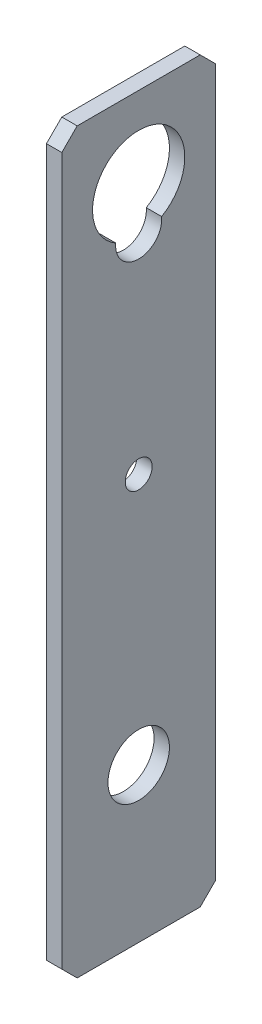
ISO-10303-21;
HEADER;
FILE_DESCRIPTION(('STEP AP214'),'2;1');
FILE_NAME('part.step','',(''),(''),'','','');
FILE_SCHEMA(('AUTOMOTIVE_DESIGN { 1 0 10303 214 1 1 1 1 }'));
ENDSEC;
DATA;
#1=APPLICATION_CONTEXT('core data for automotive mechanical design processes');
#2=APPLICATION_PROTOCOL_DEFINITION('international standard','automotive_design',2000,#1);
#3=PRODUCT_CONTEXT('',#1,'mechanical');
#4=PRODUCT('Part','Part','',(#3));
#5=PRODUCT_RELATED_PRODUCT_CATEGORY('part','',(#4));
#6=PRODUCT_DEFINITION_FORMATION('','',#4);
#7=PRODUCT_DEFINITION_CONTEXT('part definition',#1,'design');
#8=PRODUCT_DEFINITION('design','',#6,#7);
#9=PRODUCT_DEFINITION_SHAPE('','',#8);
#10=(LENGTH_UNIT() NAMED_UNIT(*) SI_UNIT(.MILLI.,.METRE.));
#11=(NAMED_UNIT(*) PLANE_ANGLE_UNIT() SI_UNIT($,.RADIAN.));
#12=(NAMED_UNIT(*) SI_UNIT($,.STERADIAN.) SOLID_ANGLE_UNIT());
#13=UNCERTAINTY_MEASURE_WITH_UNIT(LENGTH_MEASURE(1.E-05),#10,'distance_accuracy_value','');
#14=(GEOMETRIC_REPRESENTATION_CONTEXT(3) GLOBAL_UNCERTAINTY_ASSIGNED_CONTEXT((#13)) GLOBAL_UNIT_ASSIGNED_CONTEXT((#10,
#11,#12)) REPRESENTATION_CONTEXT('',''));
#15=CARTESIAN_POINT('',(0.,0.,0.));
#16=DIRECTION('',(0.,0.,1.));
#17=DIRECTION('',(1.,0.,0.));
#18=AXIS2_PLACEMENT_3D('',#15,#16,#17);
#19=CARTESIAN_POINT('',(2.,0.,0.));
#20=DIRECTION('',(0.,0.,-1.));
#21=DIRECTION('',(-1.,0.,0.));
#22=AXIS2_PLACEMENT_3D('',#19,#20,#21);
#23=PLANE('',#22);
#24=DIRECTION('',(0.,-1.,0.));
#25=VECTOR('',#24,1.);
#26=CARTESIAN_POINT('',(0.,0.,0.));
#27=LINE('',#26,#25);
#28=CARTESIAN_POINT('',(0.,94.,0.));
#29=VERTEX_POINT('',#28);
#30=CARTESIAN_POINT('',(0.,2.00000000000003,0.));
#31=VERTEX_POINT('',#30);
#32=EDGE_CURVE('E153',#29,#31,#27,.T.);
#33=ORIENTED_EDGE('',*,*,#32,.T.);
#34=DIRECTION('',(1.,0.,0.));
#35=VECTOR('',#34,1.);
#36=CARTESIAN_POINT('',(2.,2.00000000000003,0.));
#37=LINE('',#36,#35);
#38=CARTESIAN_POINT('',(2.,2.00000000000003,0.));
#39=VERTEX_POINT('',#38);
#40=EDGE_CURVE('E205',#31,#39,#37,.T.);
#41=ORIENTED_EDGE('',*,*,#40,.T.);
#42=DIRECTION('',(0.,-1.,0.));
#43=VECTOR('',#42,1.);
#44=CARTESIAN_POINT('',(2.,0.,0.));
#45=LINE('',#44,#43);
#46=CARTESIAN_POINT('',(2.,94.,0.));
#47=VERTEX_POINT('',#46);
#48=EDGE_CURVE('E157',#47,#39,#45,.T.);
#49=ORIENTED_EDGE('',*,*,#48,.F.);
#50=DIRECTION('',(-1.,0.,0.));
#51=VECTOR('',#50,1.);
#52=CARTESIAN_POINT('',(2.,94.,0.));
#53=LINE('',#52,#51);
#54=EDGE_CURVE('E202',#47,#29,#53,.T.);
#55=ORIENTED_EDGE('',*,*,#54,.T.);
#56=EDGE_LOOP('',(#33,#41,#49,#55));
#57=FACE_BOUND('',#56,.T.);
#58=ADVANCED_FACE('F43',(#57),#23,.F.);
#59=CARTESIAN_POINT('',(2.,0.,0.));
#60=DIRECTION('',(0.,1.,0.));
#61=DIRECTION('',(0.,0.,1.));
#62=AXIS2_PLACEMENT_3D('',#59,#60,#61);
#63=PLANE('',#62);
#64=DIRECTION('',(0.,0.,-1.));
#65=VECTOR('',#64,1.);
#66=CARTESIAN_POINT('',(0.,0.,0.));
#67=LINE('',#66,#65);
#68=CARTESIAN_POINT('',(0.,0.,-2.00000000000002));
#69=VERTEX_POINT('',#68);
#70=CARTESIAN_POINT('',(0.,0.,-18.));
#71=VERTEX_POINT('',#70);
#72=EDGE_CURVE('E171',#69,#71,#67,.T.);
#73=ORIENTED_EDGE('',*,*,#72,.T.);
#74=DIRECTION('',(1.,0.,0.));
#75=VECTOR('',#74,1.);
#76=CARTESIAN_POINT('',(2.,0.,-18.));
#77=LINE('',#76,#75);
#78=CARTESIAN_POINT('',(2.,0.,-18.));
#79=VERTEX_POINT('',#78);
#80=EDGE_CURVE('E193',#71,#79,#77,.T.);
#81=ORIENTED_EDGE('',*,*,#80,.T.);
#82=DIRECTION('',(0.,0.,-1.));
#83=VECTOR('',#82,1.);
#84=CARTESIAN_POINT('',(2.,0.,0.));
#85=LINE('',#84,#83);
#86=CARTESIAN_POINT('',(2.,0.,-2.00000000000002));
#87=VERTEX_POINT('',#86);
#88=EDGE_CURVE('E160',#87,#79,#85,.T.);
#89=ORIENTED_EDGE('',*,*,#88,.F.);
#90=DIRECTION('',(-1.,0.,0.));
#91=VECTOR('',#90,1.);
#92=CARTESIAN_POINT('',(2.,0.,-2.00000000000002));
#93=LINE('',#92,#91);
#94=EDGE_CURVE('E190',#87,#69,#93,.T.);
#95=ORIENTED_EDGE('',*,*,#94,.T.);
#96=EDGE_LOOP('',(#73,#81,#89,#95));
#97=FACE_BOUND('',#96,.T.);
#98=ADVANCED_FACE('F219',(#97),#63,.F.);
#99=CARTESIAN_POINT('',(2.,0.,-20.));
#100=DIRECTION('',(0.,0.,1.));
#101=DIRECTION('',(1.,0.,0.));
#102=AXIS2_PLACEMENT_3D('',#99,#100,#101);
#103=PLANE('',#102);
#104=DIRECTION('',(0.,1.,0.));
#105=VECTOR('',#104,1.);
#106=CARTESIAN_POINT('',(2.,0.,-20.));
#107=LINE('',#106,#105);
#108=CARTESIAN_POINT('',(2.,2.00000000000002,-20.));
#109=VERTEX_POINT('',#108);
#110=CARTESIAN_POINT('',(2.,94.,-20.));
#111=VERTEX_POINT('',#110);
#112=EDGE_CURVE('E164',#109,#111,#107,.T.);
#113=ORIENTED_EDGE('',*,*,#112,.F.);
#114=DIRECTION('',(-1.,0.,0.));
#115=VECTOR('',#114,1.);
#116=CARTESIAN_POINT('',(2.,2.00000000000002,-20.));
#117=LINE('',#116,#115);
#118=CARTESIAN_POINT('',(0.,2.00000000000002,-20.));
#119=VERTEX_POINT('',#118);
#120=EDGE_CURVE('E179',#109,#119,#117,.T.);
#121=ORIENTED_EDGE('',*,*,#120,.T.);
#122=DIRECTION('',(0.,1.,0.));
#123=VECTOR('',#122,1.);
#124=CARTESIAN_POINT('',(0.,0.,-20.));
#125=LINE('',#124,#123);
#126=CARTESIAN_POINT('',(0.,94.,-20.));
#127=VERTEX_POINT('',#126);
#128=EDGE_CURVE('E174',#119,#127,#125,.T.);
#129=ORIENTED_EDGE('',*,*,#128,.T.);
#130=DIRECTION('',(1.,0.,0.));
#131=VECTOR('',#130,1.);
#132=CARTESIAN_POINT('',(2.,94.,-20.));
#133=LINE('',#132,#131);
#134=EDGE_CURVE('E168',#127,#111,#133,.T.);
#135=ORIENTED_EDGE('',*,*,#134,.T.);
#136=EDGE_LOOP('',(#113,#121,#129,#135));
#137=FACE_BOUND('',#136,.T.);
#138=ADVANCED_FACE('F230',(#137),#103,.F.);
#139=CARTESIAN_POINT('',(2.,96.,0.));
#140=DIRECTION('',(0.,-1.,0.));
#141=DIRECTION('',(0.,0.,-1.));
#142=AXIS2_PLACEMENT_3D('',#139,#140,#141);
#143=PLANE('',#142);
#144=DIRECTION('',(0.,0.,1.));
#145=VECTOR('',#144,1.);
#146=CARTESIAN_POINT('',(2.,96.,0.));
#147=LINE('',#146,#145);
#148=CARTESIAN_POINT('',(2.,96.,-18.));
#149=VERTEX_POINT('',#148);
#150=CARTESIAN_POINT('',(2.,96.,-2.00000000000002));
#151=VERTEX_POINT('',#150);
#152=EDGE_CURVE('E166',#149,#151,#147,.T.);
#153=ORIENTED_EDGE('',*,*,#152,.F.);
#154=DIRECTION('',(-1.,0.,0.));
#155=VECTOR('',#154,1.);
#156=CARTESIAN_POINT('',(2.,96.,-18.));
#157=LINE('',#156,#155);
#158=CARTESIAN_POINT('',(0.,96.,-18.));
#159=VERTEX_POINT('',#158);
#160=EDGE_CURVE('E11',#149,#159,#157,.T.);
#161=ORIENTED_EDGE('',*,*,#160,.T.);
#162=DIRECTION('',(0.,0.,1.));
#163=VECTOR('',#162,1.);
#164=CARTESIAN_POINT('',(0.,96.,0.));
#165=LINE('',#164,#163);
#166=CARTESIAN_POINT('',(0.,96.,-2.00000000000002));
#167=VERTEX_POINT('',#166);
#168=EDGE_CURVE('E161',#159,#167,#165,.T.);
#169=ORIENTED_EDGE('',*,*,#168,.T.);
#170=DIRECTION('',(1.,0.,0.));
#171=VECTOR('',#170,1.);
#172=CARTESIAN_POINT('',(2.,96.,-2.00000000000002));
#173=LINE('',#172,#171);
#174=EDGE_CURVE('E52',#167,#151,#173,.T.);
#175=ORIENTED_EDGE('',*,*,#174,.T.);
#176=EDGE_LOOP('',(#153,#161,#169,#175));
#177=FACE_BOUND('',#176,.T.);
#178=ADVANCED_FACE('F236',(#177),#143,.F.);
#179=CARTESIAN_POINT('',(2.,0.,0.));
#180=DIRECTION('',(-1.,0.,0.));
#181=DIRECTION('',(0.,0.,1.));
#182=AXIS2_PLACEMENT_3D('',#179,#180,#181);
#183=PLANE('',#182);
#184=CARTESIAN_POINT('',(2.,85.5,-10.));
#185=DIRECTION('',(1.,0.,0.));
#186=DIRECTION('',(0.,0.,-1.));
#187=AXIS2_PLACEMENT_3D('',#184,#185,#186);
#188=CIRCLE('',#187,5.99999999999999);
#189=CARTESIAN_POINT('',(2.,80.2954545454546,-12.985415651391));
#190=VERTEX_POINT('',#189);
#191=CARTESIAN_POINT('',(2.,80.2954545454546,-7.01458434860902));
#192=VERTEX_POINT('',#191);
#193=EDGE_CURVE('E135',#190,#192,#188,.T.);
#194=ORIENTED_EDGE('',*,*,#193,.F.);
#195=CARTESIAN_POINT('',(2.,80.,-10.));
#196=DIRECTION('',(1.,0.,0.));
#197=DIRECTION('',(0.,0.,-1.));
#198=AXIS2_PLACEMENT_3D('',#195,#196,#197);
#199=CIRCLE('',#198,3.);
#200=EDGE_CURVE('E125',#192,#190,#199,.T.);
#201=ORIENTED_EDGE('',*,*,#200,.F.);
#202=EDGE_LOOP('',(#194,#201));
#203=FACE_BOUND('',#202,.T.);
#204=CARTESIAN_POINT('',(2.,20.,-10.));
#205=DIRECTION('',(1.,0.,0.));
#206=DIRECTION('',(0.,0.,-1.));
#207=AXIS2_PLACEMENT_3D('',#204,#205,#206);
#208=CIRCLE('',#207,4.);
#209=CARTESIAN_POINT('',(2.,20.,-14.));
#210=VERTEX_POINT('',#209);
#211=EDGE_CURVE('E144',#210,#210,#208,.T.);
#212=ORIENTED_EDGE('',*,*,#211,.F.);
#213=EDGE_LOOP('',(#212));
#214=FACE_BOUND('',#213,.T.);
#215=CARTESIAN_POINT('',(2.,52.75,-10.));
#216=DIRECTION('',(1.,0.,0.));
#217=DIRECTION('',(0.,0.,-1.));
#218=AXIS2_PLACEMENT_3D('',#215,#216,#217);
#219=CIRCLE('',#218,1.75);
#220=CARTESIAN_POINT('',(2.,52.75,-11.75));
#221=VERTEX_POINT('',#220);
#222=EDGE_CURVE('E154',#221,#221,#219,.T.);
#223=ORIENTED_EDGE('',*,*,#222,.F.);
#224=EDGE_LOOP('',(#223));
#225=FACE_BOUND('',#224,.T.);
#226=ORIENTED_EDGE('',*,*,#88,.T.);
#227=DIRECTION('',(0.,-0.707106781186545,0.70710678118655));
#228=VECTOR('',#227,1.);
#229=CARTESIAN_POINT('',(2.,2.00000000000002,-20.));
#230=LINE('',#229,#228);
#231=EDGE_CURVE('E200',#79,#109,#230,.F.);
#232=ORIENTED_EDGE('',*,*,#231,.T.);
#233=ORIENTED_EDGE('',*,*,#112,.T.);
#234=DIRECTION('',(0.,-0.70710678118655,-0.707106781186545));
#235=VECTOR('',#234,1.);
#236=CARTESIAN_POINT('',(2.,96.,-18.));
#237=LINE('',#236,#235);
#238=EDGE_CURVE('E65',#111,#149,#237,.F.);
#239=ORIENTED_EDGE('',*,*,#238,.T.);
#240=ORIENTED_EDGE('',*,*,#152,.T.);
#241=DIRECTION('',(0.,0.707106781186545,-0.70710678118655));
#242=VECTOR('',#241,1.);
#243=CARTESIAN_POINT('',(2.,94.,0.));
#244=LINE('',#243,#242);
#245=EDGE_CURVE('E195',#151,#47,#244,.F.);
#246=ORIENTED_EDGE('',*,*,#245,.T.);
#247=ORIENTED_EDGE('',*,*,#48,.T.);
#248=DIRECTION('',(0.,0.70710678118655,0.707106781186545));
#249=VECTOR('',#248,1.);
#250=CARTESIAN_POINT('',(2.,0.,-2.00000000000002));
#251=LINE('',#250,#249);
#252=EDGE_CURVE('E198',#39,#87,#251,.F.);
#253=ORIENTED_EDGE('',*,*,#252,.T.);
#254=EDGE_LOOP('',(#226,#232,#233,#239,#240,#246,#247,#253));
#255=FACE_BOUND('',#254,.T.);
#256=ADVANCED_FACE('F139',(#203,#214,#225,#255),#183,.F.);
#257=CARTESIAN_POINT('',(0.,0.,0.));
#258=DIRECTION('',(-1.,0.,0.));
#259=DIRECTION('',(0.,0.,1.));
#260=AXIS2_PLACEMENT_3D('',#257,#258,#259);
#261=PLANE('',#260);
#262=CARTESIAN_POINT('',(0.,80.,-10.));
#263=DIRECTION('',(1.,0.,0.));
#264=DIRECTION('',(0.,0.,-1.));
#265=AXIS2_PLACEMENT_3D('',#262,#263,#264);
#266=CIRCLE('',#265,3.);
#267=CARTESIAN_POINT('',(0.,80.2954545454546,-7.01458434860902));
#268=VERTEX_POINT('',#267);
#269=CARTESIAN_POINT('',(0.,80.2954545454546,-12.985415651391));
#270=VERTEX_POINT('',#269);
#271=EDGE_CURVE('E128',#268,#270,#266,.T.);
#272=ORIENTED_EDGE('',*,*,#271,.T.);
#273=CARTESIAN_POINT('',(0.,85.5,-10.));
#274=DIRECTION('',(1.,0.,0.));
#275=DIRECTION('',(0.,0.,-1.));
#276=AXIS2_PLACEMENT_3D('',#273,#274,#275);
#277=CIRCLE('',#276,5.99999999999999);
#278=EDGE_CURVE('E147',#270,#268,#277,.T.);
#279=ORIENTED_EDGE('',*,*,#278,.T.);
#280=EDGE_LOOP('',(#272,#279));
#281=FACE_BOUND('',#280,.T.);
#282=CARTESIAN_POINT('',(0.,20.,-10.));
#283=DIRECTION('',(1.,0.,0.));
#284=DIRECTION('',(0.,0.,-1.));
#285=AXIS2_PLACEMENT_3D('',#282,#283,#284);
#286=CIRCLE('',#285,4.);
#287=CARTESIAN_POINT('',(0.,20.,-14.));
#288=VERTEX_POINT('',#287);
#289=EDGE_CURVE('E141',#288,#288,#286,.T.);
#290=ORIENTED_EDGE('',*,*,#289,.T.);
#291=EDGE_LOOP('',(#290));
#292=FACE_BOUND('',#291,.T.);
#293=CARTESIAN_POINT('',(0.,52.75,-10.));
#294=DIRECTION('',(1.,0.,0.));
#295=DIRECTION('',(0.,0.,-1.));
#296=AXIS2_PLACEMENT_3D('',#293,#294,#295);
#297=CIRCLE('',#296,1.75);
#298=CARTESIAN_POINT('',(0.,52.75,-11.75));
#299=VERTEX_POINT('',#298);
#300=EDGE_CURVE('E150',#299,#299,#297,.T.);
#301=ORIENTED_EDGE('',*,*,#300,.T.);
#302=EDGE_LOOP('',(#301));
#303=FACE_BOUND('',#302,.T.);
#304=ORIENTED_EDGE('',*,*,#128,.F.);
#305=DIRECTION('',(0.,0.707106781186545,-0.70710678118655));
#306=VECTOR('',#305,1.);
#307=CARTESIAN_POINT('',(0.,-8.99999999999999,-8.99999999999992));
#308=LINE('',#307,#306);
#309=EDGE_CURVE('E188',#119,#71,#308,.F.);
#310=ORIENTED_EDGE('',*,*,#309,.T.);
#311=ORIENTED_EDGE('',*,*,#72,.F.);
#312=DIRECTION('',(0.,-0.70710678118655,-0.707106781186545));
#313=VECTOR('',#312,1.);
#314=CARTESIAN_POINT('',(0.,1.00000000000001,-1.00000000000001));
#315=LINE('',#314,#313);
#316=EDGE_CURVE('E186',#69,#31,#315,.F.);
#317=ORIENTED_EDGE('',*,*,#316,.T.);
#318=ORIENTED_EDGE('',*,*,#32,.F.);
#319=DIRECTION('',(0.,-0.707106781186545,0.70710678118655));
#320=VECTOR('',#319,1.);
#321=CARTESIAN_POINT('',(0.,47.0000000000003,47.));
#322=LINE('',#321,#320);
#323=EDGE_CURVE('E182',#29,#167,#322,.F.);
#324=ORIENTED_EDGE('',*,*,#323,.T.);
#325=ORIENTED_EDGE('',*,*,#168,.F.);
#326=DIRECTION('',(0.,0.70710678118655,0.707106781186545));
#327=VECTOR('',#326,1.);
#328=CARTESIAN_POINT('',(0.,56.9999999999997,-57.0000000000001));
#329=LINE('',#328,#327);
#330=EDGE_CURVE('E184',#159,#127,#329,.F.);
#331=ORIENTED_EDGE('',*,*,#330,.T.);
#332=EDGE_LOOP('',(#304,#310,#311,#317,#318,#324,#325,#331));
#333=FACE_BOUND('',#332,.T.);
#334=ADVANCED_FACE('F223',(#281,#292,#303,#333),#261,.T.);
#335=CARTESIAN_POINT('',(0.,52.75,-10.));
#336=DIRECTION('',(1.,0.,0.));
#337=DIRECTION('',(0.,0.,-1.));
#338=AXIS2_PLACEMENT_3D('',#335,#336,#337);
#339=CYLINDRICAL_SURFACE('',#338,1.75);
#340=ORIENTED_EDGE('',*,*,#300,.F.);
#341=EDGE_LOOP('',(#340));
#342=FACE_BOUND('',#341,.T.);
#343=ORIENTED_EDGE('',*,*,#222,.T.);
#344=EDGE_LOOP('',(#343));
#345=FACE_BOUND('',#344,.T.);
#346=ADVANCED_FACE('F307',(#342,#345),#339,.F.);
#347=CARTESIAN_POINT('',(0.,20.,-10.));
#348=DIRECTION('',(1.,0.,0.));
#349=DIRECTION('',(0.,0.,-1.));
#350=AXIS2_PLACEMENT_3D('',#347,#348,#349);
#351=CYLINDRICAL_SURFACE('',#350,4.);
#352=ORIENTED_EDGE('',*,*,#289,.F.);
#353=EDGE_LOOP('',(#352));
#354=FACE_BOUND('',#353,.T.);
#355=ORIENTED_EDGE('',*,*,#211,.T.);
#356=EDGE_LOOP('',(#355));
#357=FACE_BOUND('',#356,.T.);
#358=ADVANCED_FACE('F299',(#354,#357),#351,.F.);
#359=CARTESIAN_POINT('',(0.,80.,-10.));
#360=DIRECTION('',(1.,0.,0.));
#361=DIRECTION('',(0.,0.,-1.));
#362=AXIS2_PLACEMENT_3D('',#359,#360,#361);
#363=CYLINDRICAL_SURFACE('',#362,3.);
#364=ORIENTED_EDGE('',*,*,#200,.T.);
#365=DIRECTION('',(1.,0.,0.));
#366=VECTOR('',#365,1.);
#367=CARTESIAN_POINT('',(0.,80.2954545454546,-12.985415651391));
#368=LINE('',#367,#366);
#369=EDGE_CURVE('E132',#270,#190,#368,.T.);
#370=ORIENTED_EDGE('',*,*,#369,.F.);
#371=ORIENTED_EDGE('',*,*,#271,.F.);
#372=DIRECTION('',(1.,0.,0.));
#373=VECTOR('',#372,1.);
#374=CARTESIAN_POINT('',(0.,80.2954545454546,-7.01458434860902));
#375=LINE('',#374,#373);
#376=EDGE_CURVE('E121',#268,#192,#375,.T.);
#377=ORIENTED_EDGE('',*,*,#376,.T.);
#378=EDGE_LOOP('',(#364,#370,#371,#377));
#379=FACE_BOUND('',#378,.T.);
#380=ADVANCED_FACE('F123',(#379),#363,.F.);
#381=CARTESIAN_POINT('',(0.,85.5,-10.));
#382=DIRECTION('',(1.,0.,0.));
#383=DIRECTION('',(0.,0.,-1.));
#384=AXIS2_PLACEMENT_3D('',#381,#382,#383);
#385=CYLINDRICAL_SURFACE('',#384,5.99999999999999);
#386=ORIENTED_EDGE('',*,*,#193,.T.);
#387=ORIENTED_EDGE('',*,*,#376,.F.);
#388=ORIENTED_EDGE('',*,*,#278,.F.);
#389=ORIENTED_EDGE('',*,*,#369,.T.);
#390=EDGE_LOOP('',(#386,#387,#388,#389));
#391=FACE_BOUND('',#390,.T.);
#392=ADVANCED_FACE('F136',(#391),#385,.F.);
#393=CARTESIAN_POINT('',(2.,2.00000000000002,-20.));
#394=DIRECTION('',(0.,0.70710678118655,0.707106781186545));
#395=DIRECTION('',(-1.,0.,0.));
#396=AXIS2_PLACEMENT_3D('',#393,#394,#395);
#397=PLANE('',#396);
#398=ORIENTED_EDGE('',*,*,#231,.F.);
#399=ORIENTED_EDGE('',*,*,#80,.F.);
#400=ORIENTED_EDGE('',*,*,#309,.F.);
#401=ORIENTED_EDGE('',*,*,#120,.F.);
#402=EDGE_LOOP('',(#398,#399,#400,#401));
#403=FACE_BOUND('',#402,.T.);
#404=ADVANCED_FACE('F227',(#403),#397,.F.);
#405=CARTESIAN_POINT('',(2.,0.,-2.00000000000002));
#406=DIRECTION('',(0.,0.707106781186545,-0.70710678118655));
#407=DIRECTION('',(-1.,0.,0.));
#408=AXIS2_PLACEMENT_3D('',#405,#406,#407);
#409=PLANE('',#408);
#410=ORIENTED_EDGE('',*,*,#252,.F.);
#411=ORIENTED_EDGE('',*,*,#40,.F.);
#412=ORIENTED_EDGE('',*,*,#316,.F.);
#413=ORIENTED_EDGE('',*,*,#94,.F.);
#414=EDGE_LOOP('',(#410,#411,#412,#413));
#415=FACE_BOUND('',#414,.T.);
#416=ADVANCED_FACE('F216',(#415),#409,.F.);
#417=CARTESIAN_POINT('',(2.,96.,-18.));
#418=DIRECTION('',(0.,-0.707106781186545,0.70710678118655));
#419=DIRECTION('',(-1.,0.,0.));
#420=AXIS2_PLACEMENT_3D('',#417,#418,#419);
#421=PLANE('',#420);
#422=ORIENTED_EDGE('',*,*,#238,.F.);
#423=ORIENTED_EDGE('',*,*,#134,.F.);
#424=ORIENTED_EDGE('',*,*,#330,.F.);
#425=ORIENTED_EDGE('',*,*,#160,.F.);
#426=EDGE_LOOP('',(#422,#423,#424,#425));
#427=FACE_BOUND('',#426,.T.);
#428=ADVANCED_FACE('F234',(#427),#421,.F.);
#429=CARTESIAN_POINT('',(2.,94.,0.));
#430=DIRECTION('',(0.,-0.70710678118655,-0.707106781186545));
#431=DIRECTION('',(-1.,0.,0.));
#432=AXIS2_PLACEMENT_3D('',#429,#430,#431);
#433=PLANE('',#432);
#434=ORIENTED_EDGE('',*,*,#245,.F.);
#435=ORIENTED_EDGE('',*,*,#174,.F.);
#436=ORIENTED_EDGE('',*,*,#323,.F.);
#437=ORIENTED_EDGE('',*,*,#54,.F.);
#438=EDGE_LOOP('',(#434,#435,#436,#437));
#439=FACE_BOUND('',#438,.T.);
#440=ADVANCED_FACE('F46',(#439),#433,.F.);
#441=CLOSED_SHELL('',(#58,#98,#138,#178,#256,#334,#346,#358,#380,#392,#404,#416,#428,#440));
#442=MANIFOLD_SOLID_BREP('B2',#441);
#443=ADVANCED_BREP_SHAPE_REPRESENTATION('',(#18,#442),#14);
#444=SHAPE_DEFINITION_REPRESENTATION(#9,#443);
ENDSEC;
END-ISO-10303-21;
